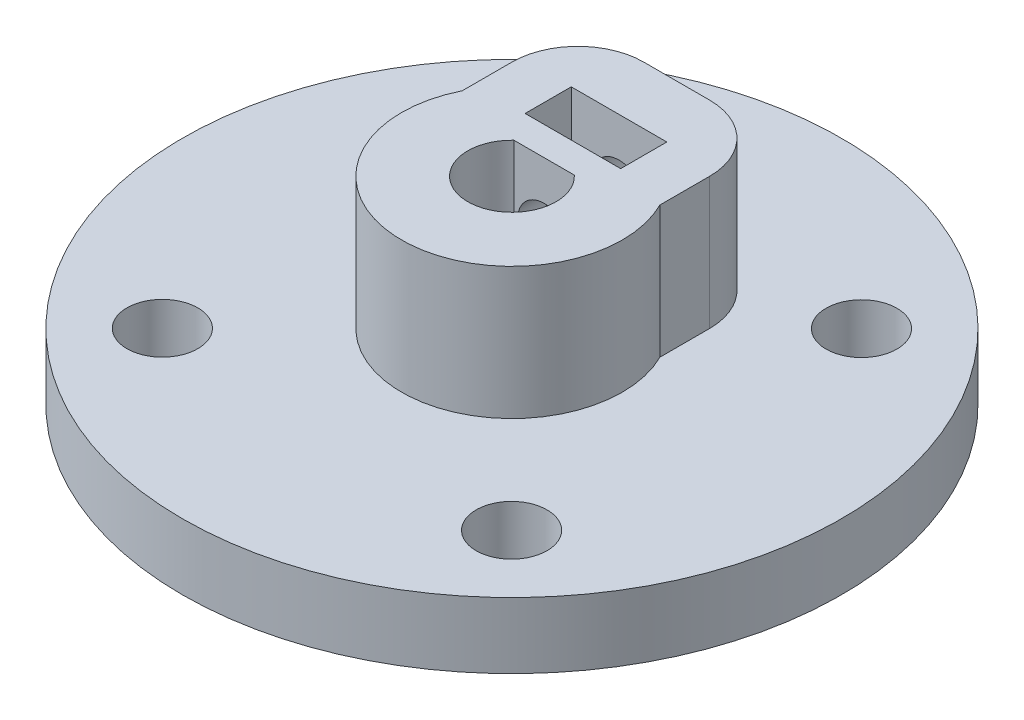
ISO-10303-21;
HEADER;
FILE_DESCRIPTION(('STEP AP214'),'2;1');
FILE_NAME('part.step','',(''),(''),'','','');
FILE_SCHEMA(('AUTOMOTIVE_DESIGN { 1 0 10303 214 1 1 1 1 }'));
ENDSEC;
DATA;
#1=APPLICATION_CONTEXT('core data for automotive mechanical design processes');
#2=APPLICATION_PROTOCOL_DEFINITION('international standard','automotive_design',2000,#1);
#3=PRODUCT_CONTEXT('',#1,'mechanical');
#4=PRODUCT('Part','Part','',(#3));
#5=PRODUCT_RELATED_PRODUCT_CATEGORY('part','',(#4));
#6=PRODUCT_DEFINITION_FORMATION('','',#4);
#7=PRODUCT_DEFINITION_CONTEXT('part definition',#1,'design');
#8=PRODUCT_DEFINITION('design','',#6,#7);
#9=PRODUCT_DEFINITION_SHAPE('','',#8);
#10=(LENGTH_UNIT() NAMED_UNIT(*) SI_UNIT(.MILLI.,.METRE.));
#11=(NAMED_UNIT(*) PLANE_ANGLE_UNIT() SI_UNIT($,.RADIAN.));
#12=(NAMED_UNIT(*) SI_UNIT($,.STERADIAN.) SOLID_ANGLE_UNIT());
#13=UNCERTAINTY_MEASURE_WITH_UNIT(LENGTH_MEASURE(1.E-05),#10,'distance_accuracy_value','');
#14=(GEOMETRIC_REPRESENTATION_CONTEXT(3) GLOBAL_UNCERTAINTY_ASSIGNED_CONTEXT((#13)) GLOBAL_UNIT_ASSIGNED_CONTEXT((#10,
#11,#12)) REPRESENTATION_CONTEXT('',''));
#15=CARTESIAN_POINT('',(0.,0.,0.));
#16=DIRECTION('',(0.,0.,1.));
#17=DIRECTION('',(1.,0.,0.));
#18=AXIS2_PLACEMENT_3D('',#15,#16,#17);
#19=CARTESIAN_POINT('',(0.,0.,0.));
#20=DIRECTION('',(0.,-1.,0.));
#21=DIRECTION('',(0.,0.,-1.));
#22=AXIS2_PLACEMENT_3D('',#19,#20,#21);
#23=PLANE('',#22);
#24=DIRECTION('',(0.,0.,-1.));
#25=VECTOR('',#24,1.);
#26=CARTESIAN_POINT('',(-2.9,0.,-3.7));
#27=LINE('',#26,#25);
#28=CARTESIAN_POINT('',(-2.9,0.,-3.7));
#29=VERTEX_POINT('',#28);
#30=CARTESIAN_POINT('',(-2.9,0.,-6.5));
#31=VERTEX_POINT('',#30);
#32=EDGE_CURVE('E144',#29,#31,#27,.T.);
#33=ORIENTED_EDGE('',*,*,#32,.F.);
#34=DIRECTION('',(-1.,0.,0.));
#35=VECTOR('',#34,1.);
#36=CARTESIAN_POINT('',(-2.9,0.,-3.7));
#37=LINE('',#36,#35);
#38=CARTESIAN_POINT('',(2.9,0.,-3.7));
#39=VERTEX_POINT('',#38);
#40=EDGE_CURVE('E147',#39,#29,#37,.T.);
#41=ORIENTED_EDGE('',*,*,#40,.F.);
#42=DIRECTION('',(0.,0.,1.));
#43=VECTOR('',#42,1.);
#44=CARTESIAN_POINT('',(2.9,0.,-3.7));
#45=LINE('',#44,#43);
#46=CARTESIAN_POINT('',(2.9,0.,-6.5));
#47=VERTEX_POINT('',#46);
#48=EDGE_CURVE('E132',#47,#39,#45,.T.);
#49=ORIENTED_EDGE('',*,*,#48,.F.);
#50=DIRECTION('',(1.,0.,0.));
#51=VECTOR('',#50,1.);
#52=CARTESIAN_POINT('',(-2.9,0.,-6.5));
#53=LINE('',#52,#51);
#54=EDGE_CURVE('E138',#31,#47,#53,.T.);
#55=ORIENTED_EDGE('',*,*,#54,.F.);
#56=EDGE_LOOP('',(#33,#41,#49,#55));
#57=FACE_BOUND('',#56,.T.);
#58=ADVANCED_FACE('F16',(#57),#23,.F.);
#59=CARTESIAN_POINT('',(0.,4.,-1.));
#60=DIRECTION('',(0.,0.,-1.));
#61=DIRECTION('',(-1.,0.,0.));
#62=AXIS2_PLACEMENT_3D('',#59,#60,#61);
#63=CYLINDRICAL_SURFACE('',#62,1.6);
#64=CARTESIAN_POINT('',(0.,4.,-10.));
#65=DIRECTION('',(0.,0.,-1.));
#66=DIRECTION('',(-1.,0.,0.));
#67=AXIS2_PLACEMENT_3D('',#64,#65,#66);
#68=CIRCLE('',#67,1.6);
#69=CARTESIAN_POINT('',(-1.6,4.,-10.));
#70=VERTEX_POINT('',#69);
#71=EDGE_CURVE('E102',#70,#70,#68,.F.);
#72=ORIENTED_EDGE('',*,*,#71,.F.);
#73=EDGE_LOOP('',(#72));
#74=FACE_BOUND('',#73,.T.);
#75=CARTESIAN_POINT('',(0.,4.,-6.5));
#76=DIRECTION('',(0.,0.,-1.));
#77=DIRECTION('',(-1.,0.,0.));
#78=AXIS2_PLACEMENT_3D('',#75,#76,#77);
#79=CIRCLE('',#78,1.6);
#80=CARTESIAN_POINT('',(-1.6,4.,-6.5));
#81=VERTEX_POINT('',#80);
#82=EDGE_CURVE('E19',#81,#81,#79,.T.);
#83=ORIENTED_EDGE('',*,*,#82,.F.);
#84=EDGE_LOOP('',(#83));
#85=FACE_BOUND('',#84,.T.);
#86=ADVANCED_FACE('F207',(#74,#85),#63,.F.);
#87=CARTESIAN_POINT('',(-2.9,8.,-3.7));
#88=DIRECTION('',(0.,0.,-1.));
#89=DIRECTION('',(-1.,0.,0.));
#90=AXIS2_PLACEMENT_3D('',#87,#88,#89);
#91=PLANE('',#90);
#92=DIRECTION('',(1.,0.,0.));
#93=VECTOR('',#92,1.);
#94=CARTESIAN_POINT('',(0.,8.,-3.7));
#95=LINE('',#94,#93);
#96=CARTESIAN_POINT('',(2.9,8.,-3.7));
#97=VERTEX_POINT('',#96);
#98=CARTESIAN_POINT('',(-2.9,8.,-3.7));
#99=VERTEX_POINT('',#98);
#100=EDGE_CURVE('E201',#97,#99,#95,.F.);
#101=ORIENTED_EDGE('',*,*,#100,.F.);
#102=DIRECTION('',(0.,1.,0.));
#103=VECTOR('',#102,1.);
#104=CARTESIAN_POINT('',(2.9,8.,-3.7));
#105=LINE('',#104,#103);
#106=EDGE_CURVE('E129',#39,#97,#105,.T.);
#107=ORIENTED_EDGE('',*,*,#106,.F.);
#108=ORIENTED_EDGE('',*,*,#40,.T.);
#109=DIRECTION('',(0.,1.,0.));
#110=VECTOR('',#109,1.);
#111=CARTESIAN_POINT('',(-2.9,8.,-3.7));
#112=LINE('',#111,#110);
#113=EDGE_CURVE('E141',#99,#29,#112,.F.);
#114=ORIENTED_EDGE('',*,*,#113,.F.);
#115=EDGE_LOOP('',(#101,#107,#108,#114));
#116=FACE_BOUND('',#115,.T.);
#117=CARTESIAN_POINT('',(0.,4.,-3.7));
#118=DIRECTION('',(0.,0.,-1.));
#119=DIRECTION('',(-1.,0.,0.));
#120=AXIS2_PLACEMENT_3D('',#117,#118,#119);
#121=CIRCLE('',#120,1.6);
#122=CARTESIAN_POINT('',(-1.6,4.,-3.7));
#123=VERTEX_POINT('',#122);
#124=EDGE_CURVE('E198',#123,#123,#121,.F.);
#125=ORIENTED_EDGE('',*,*,#124,.T.);
#126=EDGE_LOOP('',(#125));
#127=FACE_BOUND('',#126,.T.);
#128=ADVANCED_FACE('F210',(#116,#127),#91,.T.);
#129=CARTESIAN_POINT('',(-2.9,8.,-3.7));
#130=DIRECTION('',(1.,0.,0.));
#131=DIRECTION('',(0.,0.,-1.));
#132=AXIS2_PLACEMENT_3D('',#129,#130,#131);
#133=PLANE('',#132);
#134=DIRECTION('',(0.,0.,1.));
#135=VECTOR('',#134,1.);
#136=CARTESIAN_POINT('',(-2.9,8.,0.));
#137=LINE('',#136,#135);
#138=CARTESIAN_POINT('',(-2.9,8.,-6.5));
#139=VERTEX_POINT('',#138);
#140=EDGE_CURVE('E316',#99,#139,#137,.F.);
#141=ORIENTED_EDGE('',*,*,#140,.F.);
#142=ORIENTED_EDGE('',*,*,#113,.T.);
#143=ORIENTED_EDGE('',*,*,#32,.T.);
#144=DIRECTION('',(0.,1.,0.));
#145=VECTOR('',#144,1.);
#146=CARTESIAN_POINT('',(-2.9,8.,-6.5));
#147=LINE('',#146,#145);
#148=EDGE_CURVE('E135',#139,#31,#147,.F.);
#149=ORIENTED_EDGE('',*,*,#148,.F.);
#150=EDGE_LOOP('',(#141,#142,#143,#149));
#151=FACE_BOUND('',#150,.T.);
#152=ADVANCED_FACE('F217',(#151),#133,.T.);
#153=CARTESIAN_POINT('',(-2.9,8.,-6.5));
#154=DIRECTION('',(0.,0.,1.));
#155=DIRECTION('',(1.,0.,0.));
#156=AXIS2_PLACEMENT_3D('',#153,#154,#155);
#157=PLANE('',#156);
#158=DIRECTION('',(1.,0.,0.));
#159=VECTOR('',#158,1.);
#160=CARTESIAN_POINT('',(0.,8.,-6.5));
#161=LINE('',#160,#159);
#162=CARTESIAN_POINT('',(2.9,8.,-6.5));
#163=VERTEX_POINT('',#162);
#164=EDGE_CURVE('E313',#139,#163,#161,.T.);
#165=ORIENTED_EDGE('',*,*,#164,.F.);
#166=ORIENTED_EDGE('',*,*,#148,.T.);
#167=ORIENTED_EDGE('',*,*,#54,.T.);
#168=DIRECTION('',(0.,1.,0.));
#169=VECTOR('',#168,1.);
#170=CARTESIAN_POINT('',(2.9,8.,-6.5));
#171=LINE('',#170,#169);
#172=EDGE_CURVE('E126',#163,#47,#171,.F.);
#173=ORIENTED_EDGE('',*,*,#172,.F.);
#174=EDGE_LOOP('',(#165,#166,#167,#173));
#175=FACE_BOUND('',#174,.T.);
#176=ORIENTED_EDGE('',*,*,#82,.T.);
#177=EDGE_LOOP('',(#176));
#178=FACE_BOUND('',#177,.T.);
#179=ADVANCED_FACE('F214',(#175,#178),#157,.T.);
#180=CARTESIAN_POINT('',(2.9,8.,-3.7));
#181=DIRECTION('',(-1.,0.,0.));
#182=DIRECTION('',(0.,0.,1.));
#183=AXIS2_PLACEMENT_3D('',#180,#181,#182);
#184=PLANE('',#183);
#185=DIRECTION('',(0.,0.,1.));
#186=VECTOR('',#185,1.);
#187=CARTESIAN_POINT('',(2.9,8.,0.));
#188=LINE('',#187,#186);
#189=EDGE_CURVE('E197',#163,#97,#188,.T.);
#190=ORIENTED_EDGE('',*,*,#189,.F.);
#191=ORIENTED_EDGE('',*,*,#172,.T.);
#192=ORIENTED_EDGE('',*,*,#48,.T.);
#193=ORIENTED_EDGE('',*,*,#106,.T.);
#194=EDGE_LOOP('',(#190,#191,#192,#193));
#195=FACE_BOUND('',#194,.T.);
#196=ADVANCED_FACE('F216',(#195),#184,.T.);
#197=CARTESIAN_POINT('',(0.,-500000.,0.));
#198=DIRECTION('',(0.,1.,0.));
#199=DIRECTION('',(0.,0.,1.));
#200=AXIS2_PLACEMENT_3D('',#197,#198,#199);
#201=CYLINDRICAL_SURFACE('',#200,6.7);
#202=DIRECTION('',(0.,1.,0.));
#203=VECTOR('',#202,1.);
#204=CARTESIAN_POINT('',(6.,-500000.,-2.98161030317512));
#205=LINE('',#204,#203);
#206=CARTESIAN_POINT('',(6.,7.99999999998602,-2.98161030317512));
#207=VERTEX_POINT('',#206);
#208=CARTESIAN_POINT('',(6.,0.,-2.98161030317512));
#209=VERTEX_POINT('',#208);
#210=EDGE_CURVE('E123',#207,#209,#205,.F.);
#211=ORIENTED_EDGE('',*,*,#210,.F.);
#212=CARTESIAN_POINT('',(0.,7.99999999998136,0.));
#213=DIRECTION('',(0.,1.,0.));
#214=DIRECTION('',(0.,0.,1.));
#215=AXIS2_PLACEMENT_3D('',#212,#213,#214);
#216=CIRCLE('',#215,6.7);
#217=CARTESIAN_POINT('',(-6.,7.99999999998602,-2.98161030317511));
#218=VERTEX_POINT('',#217);
#219=EDGE_CURVE('E194',#218,#207,#216,.T.);
#220=ORIENTED_EDGE('',*,*,#219,.F.);
#221=DIRECTION('',(0.,1.,0.));
#222=VECTOR('',#221,1.);
#223=CARTESIAN_POINT('',(-6.,-500000.,-2.98161030317512));
#224=LINE('',#223,#222);
#225=CARTESIAN_POINT('',(-6.,0.,-2.98161030317511));
#226=VERTEX_POINT('',#225);
#227=EDGE_CURVE('E115',#226,#218,#224,.T.);
#228=ORIENTED_EDGE('',*,*,#227,.F.);
#229=CARTESIAN_POINT('',(0.,0.,0.));
#230=DIRECTION('',(0.,1.,0.));
#231=DIRECTION('',(0.,0.,1.));
#232=AXIS2_PLACEMENT_3D('',#229,#230,#231);
#233=CIRCLE('',#232,6.7);
#234=EDGE_CURVE('E202',#226,#209,#233,.T.);
#235=ORIENTED_EDGE('',*,*,#234,.T.);
#236=EDGE_LOOP('',(#211,#220,#228,#235));
#237=FACE_BOUND('',#236,.T.);
#238=ADVANCED_FACE('F225',(#237),#201,.T.);
#239=CARTESIAN_POINT('',(6.,-500000.,-2.98161030317512));
#240=DIRECTION('',(1.,0.,0.));
#241=DIRECTION('',(0.,0.,-1.));
#242=AXIS2_PLACEMENT_3D('',#239,#240,#241);
#243=PLANE('',#242);
#244=DIRECTION('',(0.,1.,0.));
#245=VECTOR('',#244,1.);
#246=CARTESIAN_POINT('',(6.,-500000.,-6.));
#247=LINE('',#246,#245);
#248=CARTESIAN_POINT('',(6.,7.99999999998602,-6.));
#249=VERTEX_POINT('',#248);
#250=CARTESIAN_POINT('',(6.,-5.6843418860808E-11,-6.));
#251=VERTEX_POINT('',#250);
#252=EDGE_CURVE('E87',#249,#251,#247,.F.);
#253=ORIENTED_EDGE('',*,*,#252,.F.);
#254=DIRECTION('',(0.,0.,1.));
#255=VECTOR('',#254,1.);
#256=CARTESIAN_POINT('',(6.,8.,0.));
#257=LINE('',#256,#255);
#258=EDGE_CURVE('E193',#207,#249,#257,.F.);
#259=ORIENTED_EDGE('',*,*,#258,.F.);
#260=ORIENTED_EDGE('',*,*,#210,.T.);
#261=DIRECTION('',(0.,0.,-1.));
#262=VECTOR('',#261,1.);
#263=CARTESIAN_POINT('',(6.,0.,0.));
#264=LINE('',#263,#262);
#265=EDGE_CURVE('E92',#209,#251,#264,.T.);
#266=ORIENTED_EDGE('',*,*,#265,.T.);
#267=EDGE_LOOP('',(#253,#259,#260,#266));
#268=FACE_BOUND('',#267,.T.);
#269=ADVANCED_FACE('F289',(#268),#243,.T.);
#270=CARTESIAN_POINT('',(2.,-500000.,-6.));
#271=DIRECTION('',(0.,1.,0.));
#272=DIRECTION('',(0.,0.,1.));
#273=AXIS2_PLACEMENT_3D('',#270,#271,#272);
#274=CYLINDRICAL_SURFACE('',#273,4.);
#275=DIRECTION('',(0.,1.,0.));
#276=VECTOR('',#275,1.);
#277=CARTESIAN_POINT('',(2.,-500000.,-10.));
#278=LINE('',#277,#276);
#279=CARTESIAN_POINT('',(2.,7.99999999998602,-10.));
#280=VERTEX_POINT('',#279);
#281=CARTESIAN_POINT('',(2.,-5.6843418860808E-11,-10.));
#282=VERTEX_POINT('',#281);
#283=EDGE_CURVE('E85',#280,#282,#278,.F.);
#284=ORIENTED_EDGE('',*,*,#283,.F.);
#285=CARTESIAN_POINT('',(2.,7.99999999998136,-6.));
#286=DIRECTION('',(0.,1.,0.));
#287=DIRECTION('',(0.,0.,1.));
#288=AXIS2_PLACEMENT_3D('',#285,#286,#287);
#289=CIRCLE('',#288,4.);
#290=EDGE_CURVE('E191',#249,#280,#289,.T.);
#291=ORIENTED_EDGE('',*,*,#290,.F.);
#292=ORIENTED_EDGE('',*,*,#252,.T.);
#293=CARTESIAN_POINT('',(2.,-1.13686837721616E-10,-6.));
#294=DIRECTION('',(0.,1.,0.));
#295=DIRECTION('',(0.,0.,1.));
#296=AXIS2_PLACEMENT_3D('',#293,#294,#295);
#297=CIRCLE('',#296,4.);
#298=EDGE_CURVE('E81',#251,#282,#297,.T.);
#299=ORIENTED_EDGE('',*,*,#298,.T.);
#300=EDGE_LOOP('',(#284,#291,#292,#299));
#301=FACE_BOUND('',#300,.T.);
#302=ADVANCED_FACE('F83',(#301),#274,.T.);
#303=CARTESIAN_POINT('',(2.,-500000.,-10.));
#304=DIRECTION('',(0.,0.,-1.));
#305=DIRECTION('',(-1.,0.,0.));
#306=AXIS2_PLACEMENT_3D('',#303,#304,#305);
#307=PLANE('',#306);
#308=DIRECTION('',(0.,1.,0.));
#309=VECTOR('',#308,1.);
#310=CARTESIAN_POINT('',(-2.,-500000.,-10.));
#311=LINE('',#310,#309);
#312=CARTESIAN_POINT('',(-2.,7.99999999998602,-10.));
#313=VERTEX_POINT('',#312);
#314=CARTESIAN_POINT('',(-2.,-5.6843418860808E-11,-10.));
#315=VERTEX_POINT('',#314);
#316=EDGE_CURVE('E101',#313,#315,#311,.F.);
#317=ORIENTED_EDGE('',*,*,#316,.F.);
#318=DIRECTION('',(1.,0.,0.));
#319=VECTOR('',#318,1.);
#320=CARTESIAN_POINT('',(0.,8.,-10.));
#321=LINE('',#320,#319);
#322=EDGE_CURVE('E99',#280,#313,#321,.F.);
#323=ORIENTED_EDGE('',*,*,#322,.F.);
#324=ORIENTED_EDGE('',*,*,#283,.T.);
#325=DIRECTION('',(1.,0.,0.));
#326=VECTOR('',#325,1.);
#327=CARTESIAN_POINT('',(0.,0.,-10.));
#328=LINE('',#327,#326);
#329=EDGE_CURVE('E91',#282,#315,#328,.F.);
#330=ORIENTED_EDGE('',*,*,#329,.T.);
#331=EDGE_LOOP('',(#317,#323,#324,#330));
#332=FACE_BOUND('',#331,.T.);
#333=ORIENTED_EDGE('',*,*,#71,.T.);
#334=EDGE_LOOP('',(#333));
#335=FACE_BOUND('',#334,.T.);
#336=ADVANCED_FACE('F95',(#332,#335),#307,.T.);
#337=CARTESIAN_POINT('',(-2.,-500000.,-6.));
#338=DIRECTION('',(0.,1.,0.));
#339=DIRECTION('',(0.,0.,1.));
#340=AXIS2_PLACEMENT_3D('',#337,#338,#339);
#341=CYLINDRICAL_SURFACE('',#340,4.);
#342=DIRECTION('',(0.,1.,0.));
#343=VECTOR('',#342,1.);
#344=CARTESIAN_POINT('',(-6.,-500000.,-6.));
#345=LINE('',#344,#343);
#346=CARTESIAN_POINT('',(-6.,7.99999999998602,-6.));
#347=VERTEX_POINT('',#346);
#348=CARTESIAN_POINT('',(-6.,-5.6843418860808E-11,-6.));
#349=VERTEX_POINT('',#348);
#350=EDGE_CURVE('E116',#347,#349,#345,.F.);
#351=ORIENTED_EDGE('',*,*,#350,.F.);
#352=CARTESIAN_POINT('',(-2.,7.99999999998136,-6.));
#353=DIRECTION('',(0.,1.,0.));
#354=DIRECTION('',(0.,0.,1.));
#355=AXIS2_PLACEMENT_3D('',#352,#353,#354);
#356=CIRCLE('',#355,4.);
#357=EDGE_CURVE('E188',#313,#347,#356,.T.);
#358=ORIENTED_EDGE('',*,*,#357,.F.);
#359=ORIENTED_EDGE('',*,*,#316,.T.);
#360=CARTESIAN_POINT('',(-2.,-1.13686837721616E-10,-6.));
#361=DIRECTION('',(0.,1.,0.));
#362=DIRECTION('',(0.,0.,1.));
#363=AXIS2_PLACEMENT_3D('',#360,#361,#362);
#364=CIRCLE('',#363,4.);
#365=EDGE_CURVE('E107',#315,#349,#364,.T.);
#366=ORIENTED_EDGE('',*,*,#365,.T.);
#367=EDGE_LOOP('',(#351,#358,#359,#366));
#368=FACE_BOUND('',#367,.T.);
#369=ADVANCED_FACE('F280',(#368),#341,.T.);
#370=CARTESIAN_POINT('',(-6.,-500000.,-6.));
#371=DIRECTION('',(-1.,0.,0.));
#372=DIRECTION('',(0.,0.,1.));
#373=AXIS2_PLACEMENT_3D('',#370,#371,#372);
#374=PLANE('',#373);
#375=ORIENTED_EDGE('',*,*,#227,.T.);
#376=DIRECTION('',(0.,0.,1.));
#377=VECTOR('',#376,1.);
#378=CARTESIAN_POINT('',(-6.,8.,0.));
#379=LINE('',#378,#377);
#380=EDGE_CURVE('E187',#347,#218,#379,.T.);
#381=ORIENTED_EDGE('',*,*,#380,.F.);
#382=ORIENTED_EDGE('',*,*,#350,.T.);
#383=DIRECTION('',(0.,0.,-1.));
#384=VECTOR('',#383,1.);
#385=CARTESIAN_POINT('',(-6.,0.,0.));
#386=LINE('',#385,#384);
#387=EDGE_CURVE('E109',#349,#226,#386,.F.);
#388=ORIENTED_EDGE('',*,*,#387,.T.);
#389=EDGE_LOOP('',(#375,#381,#382,#388));
#390=FACE_BOUND('',#389,.T.);
#391=ADVANCED_FACE('F276',(#390),#374,.T.);
#392=CARTESIAN_POINT('',(0.,0.,0.));
#393=DIRECTION('',(0.,-1.,0.));
#394=DIRECTION('',(0.,0.,-1.));
#395=AXIS2_PLACEMENT_3D('',#392,#393,#394);
#396=PLANE('',#395);
#397=CARTESIAN_POINT('',(0.,0.,0.));
#398=DIRECTION('',(0.,1.,0.));
#399=DIRECTION('',(0.,0.,1.));
#400=AXIS2_PLACEMENT_3D('',#397,#398,#399);
#401=CIRCLE('',#400,20.);
#402=CARTESIAN_POINT('',(0.,0.,20.));
#403=VERTEX_POINT('',#402);
#404=EDGE_CURVE('E172',#403,#403,#401,.F.);
#405=ORIENTED_EDGE('',*,*,#404,.F.);
#406=EDGE_LOOP('',(#405));
#407=FACE_BOUND('',#406,.T.);
#408=CARTESIAN_POINT('',(-10.596309049935,0.,-10.6168844073139));
#409=DIRECTION('',(0.,1.,0.));
#410=DIRECTION('',(0.,0.,1.));
#411=AXIS2_PLACEMENT_3D('',#408,#409,#410);
#412=CIRCLE('',#411,2.15);
#413=CARTESIAN_POINT('',(-10.596309049935,0.,-8.46688440731395));
#414=VERTEX_POINT('',#413);
#415=EDGE_CURVE('E175',#414,#414,#412,.F.);
#416=ORIENTED_EDGE('',*,*,#415,.T.);
#417=EDGE_LOOP('',(#416));
#418=FACE_BOUND('',#417,.T.);
#419=CARTESIAN_POINT('',(10.5963090499353,0.,10.6168844073139));
#420=DIRECTION('',(0.,1.,0.));
#421=DIRECTION('',(0.,0.,1.));
#422=AXIS2_PLACEMENT_3D('',#419,#420,#421);
#423=CIRCLE('',#422,2.15);
#424=CARTESIAN_POINT('',(10.5963090499353,0.,12.7668844073139));
#425=VERTEX_POINT('',#424);
#426=EDGE_CURVE('E178',#425,#425,#423,.F.);
#427=ORIENTED_EDGE('',*,*,#426,.T.);
#428=EDGE_LOOP('',(#427));
#429=FACE_BOUND('',#428,.T.);
#430=CARTESIAN_POINT('',(10.6168844073141,0.,-10.5963090499352));
#431=DIRECTION('',(0.,1.,0.));
#432=DIRECTION('',(0.,0.,1.));
#433=AXIS2_PLACEMENT_3D('',#430,#431,#432);
#434=CIRCLE('',#433,2.15);
#435=CARTESIAN_POINT('',(10.6168844073141,0.,-8.44630904993516));
#436=VERTEX_POINT('',#435);
#437=EDGE_CURVE('E181',#436,#436,#434,.F.);
#438=ORIENTED_EDGE('',*,*,#437,.T.);
#439=EDGE_LOOP('',(#438));
#440=FACE_BOUND('',#439,.T.);
#441=CARTESIAN_POINT('',(-10.6168844073138,0.,10.5963090499352));
#442=DIRECTION('',(0.,1.,0.));
#443=DIRECTION('',(0.,0.,1.));
#444=AXIS2_PLACEMENT_3D('',#441,#442,#443);
#445=CIRCLE('',#444,2.15);
#446=CARTESIAN_POINT('',(-10.6168844073138,0.,12.7463090499352));
#447=VERTEX_POINT('',#446);
#448=EDGE_CURVE('E184',#447,#447,#445,.F.);
#449=ORIENTED_EDGE('',*,*,#448,.T.);
#450=EDGE_LOOP('',(#449));
#451=FACE_BOUND('',#450,.T.);
#452=ORIENTED_EDGE('',*,*,#387,.F.);
#453=ORIENTED_EDGE('',*,*,#365,.F.);
#454=ORIENTED_EDGE('',*,*,#329,.F.);
#455=ORIENTED_EDGE('',*,*,#298,.F.);
#456=ORIENTED_EDGE('',*,*,#265,.F.);
#457=ORIENTED_EDGE('',*,*,#234,.F.);
#458=EDGE_LOOP('',(#452,#453,#454,#455,#456,#457));
#459=FACE_BOUND('',#458,.T.);
#460=ADVANCED_FACE('F106',(#407,#418,#429,#440,#451,#459),#396,.F.);
#461=CARTESIAN_POINT('',(0.,4.,-1.));
#462=DIRECTION('',(0.,0.,-1.));
#463=DIRECTION('',(-1.,0.,0.));
#464=AXIS2_PLACEMENT_3D('',#461,#462,#463);
#465=CYLINDRICAL_SURFACE('',#464,1.6);
#466=CARTESIAN_POINT('',(0.,4.,-1.95407407407407));
#467=DIRECTION('',(0.,0.,-1.));
#468=DIRECTION('',(-1.,0.,0.));
#469=AXIS2_PLACEMENT_3D('',#466,#467,#468);
#470=CIRCLE('',#469,1.6);
#471=CARTESIAN_POINT('',(-1.6,4.,-1.95407407407407));
#472=VERTEX_POINT('',#471);
#473=EDGE_CURVE('E168',#472,#472,#470,.F.);
#474=ORIENTED_EDGE('',*,*,#473,.T.);
#475=EDGE_LOOP('',(#474));
#476=FACE_BOUND('',#475,.T.);
#477=ORIENTED_EDGE('',*,*,#124,.F.);
#478=EDGE_LOOP('',(#477));
#479=FACE_BOUND('',#478,.T.);
#480=ADVANCED_FACE('F269',(#476,#479),#465,.F.);
#481=CARTESIAN_POINT('',(0.,8.,0.));
#482=DIRECTION('',(0.,1.,0.));
#483=DIRECTION('',(0.,0.,1.));
#484=AXIS2_PLACEMENT_3D('',#481,#482,#483);
#485=PLANE('',#484);
#486=DIRECTION('',(-1.,0.,0.));
#487=VECTOR('',#486,1.);
#488=CARTESIAN_POINT('',(1.8341195470938,8.,-1.95407407407407));
#489=LINE('',#488,#487);
#490=CARTESIAN_POINT('',(-1.8341195470938,8.,-1.95407407407407));
#491=VERTEX_POINT('',#490);
#492=CARTESIAN_POINT('',(1.8341195470938,8.,-1.95407407407407));
#493=VERTEX_POINT('',#492);
#494=EDGE_CURVE('E171',#491,#493,#489,.F.);
#495=ORIENTED_EDGE('',*,*,#494,.T.);
#496=CARTESIAN_POINT('',(0.,8.,0.));
#497=DIRECTION('',(0.,1.,0.));
#498=DIRECTION('',(0.,0.,1.));
#499=AXIS2_PLACEMENT_3D('',#496,#497,#498);
#500=CIRCLE('',#499,2.68);
#501=EDGE_CURVE('E165',#493,#491,#500,.F.);
#502=ORIENTED_EDGE('',*,*,#501,.T.);
#503=EDGE_LOOP('',(#495,#502));
#504=FACE_BOUND('',#503,.T.);
#505=ORIENTED_EDGE('',*,*,#357,.T.);
#506=ORIENTED_EDGE('',*,*,#380,.T.);
#507=ORIENTED_EDGE('',*,*,#219,.T.);
#508=ORIENTED_EDGE('',*,*,#258,.T.);
#509=ORIENTED_EDGE('',*,*,#290,.T.);
#510=ORIENTED_EDGE('',*,*,#322,.T.);
#511=EDGE_LOOP('',(#505,#506,#507,#508,#509,#510));
#512=FACE_BOUND('',#511,.T.);
#513=ORIENTED_EDGE('',*,*,#164,.T.);
#514=ORIENTED_EDGE('',*,*,#189,.T.);
#515=ORIENTED_EDGE('',*,*,#100,.T.);
#516=ORIENTED_EDGE('',*,*,#140,.T.);
#517=EDGE_LOOP('',(#513,#514,#515,#516));
#518=FACE_BOUND('',#517,.T.);
#519=ADVANCED_FACE('F265',(#504,#512,#518),#485,.T.);
#520=CARTESIAN_POINT('',(-10.6168844073138,-10.,10.5963090499352));
#521=DIRECTION('',(0.,1.,0.));
#522=DIRECTION('',(0.,0.,1.));
#523=AXIS2_PLACEMENT_3D('',#520,#521,#522);
#524=CYLINDRICAL_SURFACE('',#523,2.15);
#525=CARTESIAN_POINT('',(-10.6168844073138,-4.,10.5963090499352));
#526=DIRECTION('',(0.,1.,0.));
#527=DIRECTION('',(0.,0.,1.));
#528=AXIS2_PLACEMENT_3D('',#525,#526,#527);
#529=CIRCLE('',#528,2.15);
#530=CARTESIAN_POINT('',(-10.6168844073138,-4.,12.7463090499352));
#531=VERTEX_POINT('',#530);
#532=EDGE_CURVE('E162',#531,#531,#529,.T.);
#533=ORIENTED_EDGE('',*,*,#532,.F.);
#534=EDGE_LOOP('',(#533));
#535=FACE_BOUND('',#534,.T.);
#536=ORIENTED_EDGE('',*,*,#448,.F.);
#537=EDGE_LOOP('',(#536));
#538=FACE_BOUND('',#537,.T.);
#539=ADVANCED_FACE('F261',(#535,#538),#524,.F.);
#540=CARTESIAN_POINT('',(10.6168844073141,-10.,-10.5963090499352));
#541=DIRECTION('',(0.,1.,0.));
#542=DIRECTION('',(0.,0.,1.));
#543=AXIS2_PLACEMENT_3D('',#540,#541,#542);
#544=CYLINDRICAL_SURFACE('',#543,2.15);
#545=CARTESIAN_POINT('',(10.6168844073141,-4.,-10.5963090499352));
#546=DIRECTION('',(0.,1.,0.));
#547=DIRECTION('',(0.,0.,1.));
#548=AXIS2_PLACEMENT_3D('',#545,#546,#547);
#549=CIRCLE('',#548,2.15);
#550=CARTESIAN_POINT('',(10.6168844073141,-4.,-8.44630904993516));
#551=VERTEX_POINT('',#550);
#552=EDGE_CURVE('E159',#551,#551,#549,.T.);
#553=ORIENTED_EDGE('',*,*,#552,.F.);
#554=EDGE_LOOP('',(#553));
#555=FACE_BOUND('',#554,.T.);
#556=ORIENTED_EDGE('',*,*,#437,.F.);
#557=EDGE_LOOP('',(#556));
#558=FACE_BOUND('',#557,.T.);
#559=ADVANCED_FACE('F257',(#555,#558),#544,.F.);
#560=CARTESIAN_POINT('',(10.5963090499353,-10.,10.6168844073139));
#561=DIRECTION('',(0.,1.,0.));
#562=DIRECTION('',(0.,0.,1.));
#563=AXIS2_PLACEMENT_3D('',#560,#561,#562);
#564=CYLINDRICAL_SURFACE('',#563,2.15);
#565=CARTESIAN_POINT('',(10.5963090499353,-4.,10.6168844073139));
#566=DIRECTION('',(0.,1.,0.));
#567=DIRECTION('',(0.,0.,1.));
#568=AXIS2_PLACEMENT_3D('',#565,#566,#567);
#569=CIRCLE('',#568,2.15);
#570=CARTESIAN_POINT('',(10.5963090499353,-4.,12.7668844073139));
#571=VERTEX_POINT('',#570);
#572=EDGE_CURVE('E156',#571,#571,#569,.T.);
#573=ORIENTED_EDGE('',*,*,#572,.F.);
#574=EDGE_LOOP('',(#573));
#575=FACE_BOUND('',#574,.T.);
#576=ORIENTED_EDGE('',*,*,#426,.F.);
#577=EDGE_LOOP('',(#576));
#578=FACE_BOUND('',#577,.T.);
#579=ADVANCED_FACE('F253',(#575,#578),#564,.F.);
#580=CARTESIAN_POINT('',(-10.596309049935,-10.,-10.6168844073139));
#581=DIRECTION('',(0.,1.,0.));
#582=DIRECTION('',(0.,0.,1.));
#583=AXIS2_PLACEMENT_3D('',#580,#581,#582);
#584=CYLINDRICAL_SURFACE('',#583,2.15);
#585=CARTESIAN_POINT('',(-10.596309049935,-4.,-10.6168844073139));
#586=DIRECTION('',(0.,1.,0.));
#587=DIRECTION('',(0.,0.,1.));
#588=AXIS2_PLACEMENT_3D('',#585,#586,#587);
#589=CIRCLE('',#588,2.15);
#590=CARTESIAN_POINT('',(-10.596309049935,-4.,-8.46688440731395));
#591=VERTEX_POINT('',#590);
#592=EDGE_CURVE('E153',#591,#591,#589,.T.);
#593=ORIENTED_EDGE('',*,*,#592,.F.);
#594=EDGE_LOOP('',(#593));
#595=FACE_BOUND('',#594,.T.);
#596=ORIENTED_EDGE('',*,*,#415,.F.);
#597=EDGE_LOOP('',(#596));
#598=FACE_BOUND('',#597,.T.);
#599=ADVANCED_FACE('F249',(#595,#598),#584,.F.);
#600=CARTESIAN_POINT('',(0.,-4.,0.));
#601=DIRECTION('',(0.,1.,0.));
#602=DIRECTION('',(0.,0.,1.));
#603=AXIS2_PLACEMENT_3D('',#600,#601,#602);
#604=CYLINDRICAL_SURFACE('',#603,20.);
#605=ORIENTED_EDGE('',*,*,#404,.T.);
#606=EDGE_LOOP('',(#605));
#607=FACE_BOUND('',#606,.T.);
#608=CARTESIAN_POINT('',(0.,-4.,0.));
#609=DIRECTION('',(0.,1.,0.));
#610=DIRECTION('',(0.,0.,1.));
#611=AXIS2_PLACEMENT_3D('',#608,#609,#610);
#612=CIRCLE('',#611,20.);
#613=CARTESIAN_POINT('',(0.,-4.,20.));
#614=VERTEX_POINT('',#613);
#615=EDGE_CURVE('E150',#614,#614,#612,.F.);
#616=ORIENTED_EDGE('',*,*,#615,.F.);
#617=EDGE_LOOP('',(#616));
#618=FACE_BOUND('',#617,.T.);
#619=ADVANCED_FACE('F246',(#607,#618),#604,.T.);
#620=CARTESIAN_POINT('',(1.8341195470938,-4.,-1.95407407407407));
#621=DIRECTION('',(0.,0.,-1.));
#622=DIRECTION('',(-1.,0.,0.));
#623=AXIS2_PLACEMENT_3D('',#620,#621,#622);
#624=PLANE('',#623);
#625=DIRECTION('',(0.,1.,0.));
#626=VECTOR('',#625,1.);
#627=CARTESIAN_POINT('',(-1.83411954709379,-4.,-1.95407407407407));
#628=LINE('',#627,#626);
#629=CARTESIAN_POINT('',(-1.8341195470938,-4.,-1.95407407407407));
#630=VERTEX_POINT('',#629);
#631=EDGE_CURVE('E34',#491,#630,#628,.F.);
#632=ORIENTED_EDGE('',*,*,#631,.T.);
#633=DIRECTION('',(1.,0.,0.));
#634=VECTOR('',#633,1.);
#635=CARTESIAN_POINT('',(0.,-4.,-1.95407407407407));
#636=LINE('',#635,#634);
#637=CARTESIAN_POINT('',(1.8341195470938,-4.,-1.95407407407407));
#638=VERTEX_POINT('',#637);
#639=EDGE_CURVE('E25',#638,#630,#636,.F.);
#640=ORIENTED_EDGE('',*,*,#639,.F.);
#641=DIRECTION('',(0.,1.,0.));
#642=VECTOR('',#641,1.);
#643=CARTESIAN_POINT('',(1.8341195470938,-4.,-1.95407407407407));
#644=LINE('',#643,#642);
#645=EDGE_CURVE('E167',#638,#493,#644,.T.);
#646=ORIENTED_EDGE('',*,*,#645,.T.);
#647=ORIENTED_EDGE('',*,*,#494,.F.);
#648=EDGE_LOOP('',(#632,#640,#646,#647));
#649=FACE_BOUND('',#648,.T.);
#650=ORIENTED_EDGE('',*,*,#473,.F.);
#651=EDGE_LOOP('',(#650));
#652=FACE_BOUND('',#651,.T.);
#653=ADVANCED_FACE('F239',(#649,#652),#624,.F.);
#654=CARTESIAN_POINT('',(0.,-4.,0.));
#655=DIRECTION('',(0.,1.,0.));
#656=DIRECTION('',(0.,0.,1.));
#657=AXIS2_PLACEMENT_3D('',#654,#655,#656);
#658=CYLINDRICAL_SURFACE('',#657,2.68);
#659=ORIENTED_EDGE('',*,*,#645,.F.);
#660=CARTESIAN_POINT('',(0.,-4.,0.));
#661=DIRECTION('',(0.,1.,0.));
#662=DIRECTION('',(0.,0.,1.));
#663=AXIS2_PLACEMENT_3D('',#660,#661,#662);
#664=CIRCLE('',#663,2.68);
#665=EDGE_CURVE('E11',#630,#638,#664,.T.);
#666=ORIENTED_EDGE('',*,*,#665,.F.);
#667=ORIENTED_EDGE('',*,*,#631,.F.);
#668=ORIENTED_EDGE('',*,*,#501,.F.);
#669=EDGE_LOOP('',(#659,#666,#667,#668));
#670=FACE_BOUND('',#669,.T.);
#671=ADVANCED_FACE('F233',(#670),#658,.F.);
#672=CARTESIAN_POINT('',(0.,-4.,0.));
#673=DIRECTION('',(0.,-1.,0.));
#674=DIRECTION('',(0.,0.,-1.));
#675=AXIS2_PLACEMENT_3D('',#672,#673,#674);
#676=PLANE('',#675);
#677=ORIENTED_EDGE('',*,*,#665,.T.);
#678=ORIENTED_EDGE('',*,*,#639,.T.);
#679=EDGE_LOOP('',(#677,#678));
#680=FACE_BOUND('',#679,.T.);
#681=ORIENTED_EDGE('',*,*,#615,.T.);
#682=EDGE_LOOP('',(#681));
#683=FACE_BOUND('',#682,.T.);
#684=ORIENTED_EDGE('',*,*,#592,.T.);
#685=EDGE_LOOP('',(#684));
#686=FACE_BOUND('',#685,.T.);
#687=ORIENTED_EDGE('',*,*,#572,.T.);
#688=EDGE_LOOP('',(#687));
#689=FACE_BOUND('',#688,.T.);
#690=ORIENTED_EDGE('',*,*,#552,.T.);
#691=EDGE_LOOP('',(#690));
#692=FACE_BOUND('',#691,.T.);
#693=ORIENTED_EDGE('',*,*,#532,.T.);
#694=EDGE_LOOP('',(#693));
#695=FACE_BOUND('',#694,.T.);
#696=ADVANCED_FACE('F231',(#680,#683,#686,#689,#692,#695),#676,.T.);
#697=CLOSED_SHELL('',(#58,#86,#128,#152,#179,#196,#238,#269,#302,#336,#369,#391,#460,#480,#519,
#539,#559,#579,#599,#619,#653,#671,#696));
#698=MANIFOLD_SOLID_BREP('B1',#697);
#699=ADVANCED_BREP_SHAPE_REPRESENTATION('',(#18,#698),#14);
#700=SHAPE_DEFINITION_REPRESENTATION(#9,#699);
ENDSEC;
END-ISO-10303-21;
